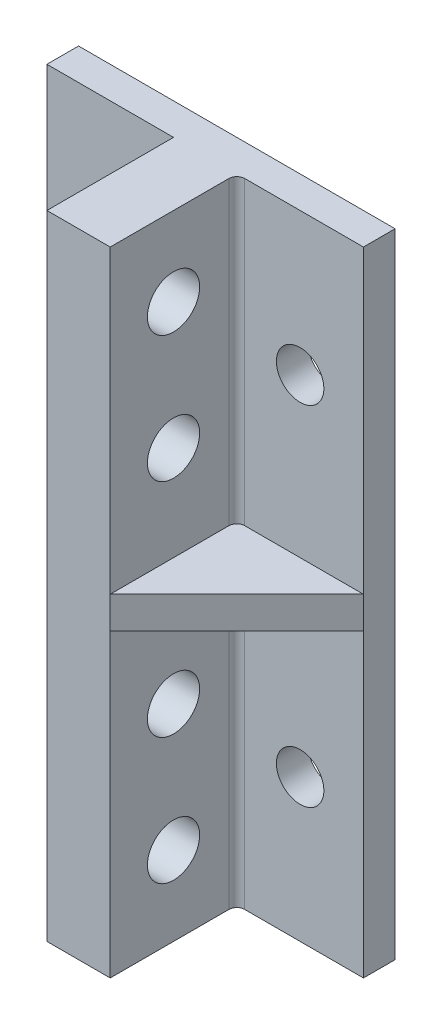
ISO-10303-21;
HEADER;
FILE_DESCRIPTION(('STEP AP214'),'2;1');
FILE_NAME('part.step','',(''),(''),'','','');
FILE_SCHEMA(('AUTOMOTIVE_DESIGN { 1 0 10303 214 1 1 1 1 }'));
ENDSEC;
DATA;
#1=APPLICATION_CONTEXT('core data for automotive mechanical design processes');
#2=APPLICATION_PROTOCOL_DEFINITION('international standard','automotive_design',2000,#1);
#3=PRODUCT_CONTEXT('',#1,'mechanical');
#4=PRODUCT('Part','Part','',(#3));
#5=PRODUCT_RELATED_PRODUCT_CATEGORY('part','',(#4));
#6=PRODUCT_DEFINITION_FORMATION('','',#4);
#7=PRODUCT_DEFINITION_CONTEXT('part definition',#1,'design');
#8=PRODUCT_DEFINITION('design','',#6,#7);
#9=PRODUCT_DEFINITION_SHAPE('','',#8);
#10=(LENGTH_UNIT() NAMED_UNIT(*) SI_UNIT(.MILLI.,.METRE.));
#11=(NAMED_UNIT(*) PLANE_ANGLE_UNIT() SI_UNIT($,.RADIAN.));
#12=(NAMED_UNIT(*) SI_UNIT($,.STERADIAN.) SOLID_ANGLE_UNIT());
#13=UNCERTAINTY_MEASURE_WITH_UNIT(LENGTH_MEASURE(1.E-05),#10,'distance_accuracy_value','');
#14=(GEOMETRIC_REPRESENTATION_CONTEXT(3) GLOBAL_UNCERTAINTY_ASSIGNED_CONTEXT((#13)) GLOBAL_UNIT_ASSIGNED_CONTEXT((#10,
#11,#12)) REPRESENTATION_CONTEXT('',''));
#15=CARTESIAN_POINT('',(0.,0.,0.));
#16=DIRECTION('',(0.,0.,1.));
#17=DIRECTION('',(1.,0.,0.));
#18=AXIS2_PLACEMENT_3D('',#15,#16,#17);
#19=CARTESIAN_POINT('',(2.5,-20.,2.5));
#20=DIRECTION('',(0.,-1.,0.));
#21=DIRECTION('',(0.,0.,-1.));
#22=AXIS2_PLACEMENT_3D('',#19,#20,#21);
#23=CYLINDRICAL_SURFACE('',#22,0.5);
#24=DIRECTION('',(0.,1.,0.));
#25=VECTOR('',#24,1.);
#26=CARTESIAN_POINT('',(2.5,0.,2.));
#27=LINE('',#26,#25);
#28=CARTESIAN_POINT('',(2.5,-20.,2.));
#29=VERTEX_POINT('',#28);
#30=CARTESIAN_POINT('',(2.5,-1.,2.));
#31=VERTEX_POINT('',#30);
#32=EDGE_CURVE('E127',#29,#31,#27,.T.);
#33=ORIENTED_EDGE('',*,*,#32,.T.);
#34=CARTESIAN_POINT('',(2.5,-1.,2.5));
#35=DIRECTION('',(0.,-1.,0.));
#36=DIRECTION('',(0.,0.,-1.));
#37=AXIS2_PLACEMENT_3D('',#34,#35,#36);
#38=CIRCLE('',#37,0.5);
#39=CARTESIAN_POINT('',(2.,-1.,2.5));
#40=VERTEX_POINT('',#39);
#41=EDGE_CURVE('E120',#31,#40,#38,.F.);
#42=ORIENTED_EDGE('',*,*,#41,.T.);
#43=DIRECTION('',(0.,1.,0.));
#44=VECTOR('',#43,1.);
#45=CARTESIAN_POINT('',(2.,-20.,2.5));
#46=LINE('',#45,#44);
#47=CARTESIAN_POINT('',(2.,-20.,2.5));
#48=VERTEX_POINT('',#47);
#49=EDGE_CURVE('E122',#40,#48,#46,.F.);
#50=ORIENTED_EDGE('',*,*,#49,.T.);
#51=CARTESIAN_POINT('',(2.5,-20.,2.5));
#52=DIRECTION('',(0.,-1.,0.));
#53=DIRECTION('',(0.,0.,-1.));
#54=AXIS2_PLACEMENT_3D('',#51,#52,#53);
#55=CIRCLE('',#54,0.5);
#56=EDGE_CURVE('E20',#29,#48,#55,.F.);
#57=ORIENTED_EDGE('',*,*,#56,.F.);
#58=EDGE_LOOP('',(#33,#42,#50,#57));
#59=FACE_BOUND('',#58,.T.);
#60=ADVANCED_FACE('F17',(#59),#23,.F.);
#61=CARTESIAN_POINT('',(0.,-1.,0.));
#62=DIRECTION('',(0.,1.,0.));
#63=DIRECTION('',(0.,0.,1.));
#64=AXIS2_PLACEMENT_3D('',#61,#62,#63);
#65=PLANE('',#64);
#66=ORIENTED_EDGE('',*,*,#41,.F.);
#67=DIRECTION('',(-1.,0.,0.));
#68=VECTOR('',#67,1.);
#69=CARTESIAN_POINT('',(0.,-1.,2.));
#70=LINE('',#69,#68);
#71=CARTESIAN_POINT('',(10.,-1.,2.));
#72=VERTEX_POINT('',#71);
#73=EDGE_CURVE('E190',#31,#72,#70,.F.);
#74=ORIENTED_EDGE('',*,*,#73,.T.);
#75=DIRECTION('',(0.707106781186547,0.,-0.707106781186548));
#76=VECTOR('',#75,1.);
#77=CARTESIAN_POINT('',(2.,-1.,10.));
#78=LINE('',#77,#76);
#79=CARTESIAN_POINT('',(2.,-1.,10.));
#80=VERTEX_POINT('',#79);
#81=EDGE_CURVE('E242',#80,#72,#78,.T.);
#82=ORIENTED_EDGE('',*,*,#81,.F.);
#83=DIRECTION('',(0.,0.,1.));
#84=VECTOR('',#83,1.);
#85=CARTESIAN_POINT('',(2.,-1.,10.));
#86=LINE('',#85,#84);
#87=EDGE_CURVE('E128',#80,#40,#86,.F.);
#88=ORIENTED_EDGE('',*,*,#87,.T.);
#89=EDGE_LOOP('',(#66,#74,#82,#88));
#90=FACE_BOUND('',#89,.T.);
#91=ADVANCED_FACE('F354',(#90),#65,.F.);
#92=CARTESIAN_POINT('',(2.5,-20.,2.5));
#93=DIRECTION('',(0.,-1.,0.));
#94=DIRECTION('',(0.,0.,-1.));
#95=AXIS2_PLACEMENT_3D('',#92,#93,#94);
#96=CYLINDRICAL_SURFACE('',#95,0.5);
#97=DIRECTION('',(0.,1.,0.));
#98=VECTOR('',#97,1.);
#99=CARTESIAN_POINT('',(2.5,0.,2.));
#100=LINE('',#99,#98);
#101=CARTESIAN_POINT('',(2.5,1.,2.));
#102=VERTEX_POINT('',#101);
#103=CARTESIAN_POINT('',(2.5,20.,2.));
#104=VERTEX_POINT('',#103);
#105=EDGE_CURVE('E162',#102,#104,#100,.T.);
#106=ORIENTED_EDGE('',*,*,#105,.T.);
#107=CARTESIAN_POINT('',(2.5,20.,2.5));
#108=DIRECTION('',(0.,-1.,0.));
#109=DIRECTION('',(0.,0.,-1.));
#110=AXIS2_PLACEMENT_3D('',#107,#108,#109);
#111=CIRCLE('',#110,0.5);
#112=CARTESIAN_POINT('',(2.,20.,2.5));
#113=VERTEX_POINT('',#112);
#114=EDGE_CURVE('E301',#113,#104,#111,.T.);
#115=ORIENTED_EDGE('',*,*,#114,.F.);
#116=DIRECTION('',(0.,1.,0.));
#117=VECTOR('',#116,1.);
#118=CARTESIAN_POINT('',(2.,-20.,2.5));
#119=LINE('',#118,#117);
#120=CARTESIAN_POINT('',(2.,1.,2.5));
#121=VERTEX_POINT('',#120);
#122=EDGE_CURVE('E146',#113,#121,#119,.F.);
#123=ORIENTED_EDGE('',*,*,#122,.T.);
#124=CARTESIAN_POINT('',(2.5,1.,2.5));
#125=DIRECTION('',(0.,-1.,0.));
#126=DIRECTION('',(0.,0.,-1.));
#127=AXIS2_PLACEMENT_3D('',#124,#125,#126);
#128=CIRCLE('',#127,0.5);
#129=EDGE_CURVE('E243',#102,#121,#128,.F.);
#130=ORIENTED_EDGE('',*,*,#129,.F.);
#131=EDGE_LOOP('',(#106,#115,#123,#130));
#132=FACE_BOUND('',#131,.T.);
#133=ADVANCED_FACE('F312',(#132),#96,.F.);
#134=CARTESIAN_POINT('',(0.,1.,0.));
#135=DIRECTION('',(0.,1.,0.));
#136=DIRECTION('',(0.,0.,1.));
#137=AXIS2_PLACEMENT_3D('',#134,#135,#136);
#138=PLANE('',#137);
#139=DIRECTION('',(0.,0.,1.));
#140=VECTOR('',#139,1.);
#141=CARTESIAN_POINT('',(2.,1.,10.));
#142=LINE('',#141,#140);
#143=CARTESIAN_POINT('',(2.,1.,10.));
#144=VERTEX_POINT('',#143);
#145=EDGE_CURVE('E148',#121,#144,#142,.T.);
#146=ORIENTED_EDGE('',*,*,#145,.T.);
#147=DIRECTION('',(0.707106781186547,0.,-0.707106781186548));
#148=VECTOR('',#147,1.);
#149=CARTESIAN_POINT('',(2.,1.,10.));
#150=LINE('',#149,#148);
#151=CARTESIAN_POINT('',(10.,1.,2.));
#152=VERTEX_POINT('',#151);
#153=EDGE_CURVE('E239',#152,#144,#150,.F.);
#154=ORIENTED_EDGE('',*,*,#153,.F.);
#155=DIRECTION('',(-1.,0.,0.));
#156=VECTOR('',#155,1.);
#157=CARTESIAN_POINT('',(0.,1.,2.));
#158=LINE('',#157,#156);
#159=EDGE_CURVE('E166',#152,#102,#158,.T.);
#160=ORIENTED_EDGE('',*,*,#159,.T.);
#161=ORIENTED_EDGE('',*,*,#129,.T.);
#162=EDGE_LOOP('',(#146,#154,#160,#161));
#163=FACE_BOUND('',#162,.T.);
#164=ADVANCED_FACE('F375',(#163),#138,.T.);
#165=CARTESIAN_POINT('',(-2.,15.,6.));
#166=DIRECTION('',(-1.,0.,0.));
#167=DIRECTION('',(0.,0.,1.));
#168=AXIS2_PLACEMENT_3D('',#165,#166,#167);
#169=CYLINDRICAL_SURFACE('',#168,1.64999999999999);
#170=CARTESIAN_POINT('',(2.,15.,6.));
#171=DIRECTION('',(-1.,0.,0.));
#172=DIRECTION('',(0.,0.,1.));
#173=AXIS2_PLACEMENT_3D('',#170,#171,#172);
#174=CIRCLE('',#173,1.64999999999999);
#175=CARTESIAN_POINT('',(2.,15.,7.64999999999999));
#176=VERTEX_POINT('',#175);
#177=EDGE_CURVE('E165',#176,#176,#174,.F.);
#178=ORIENTED_EDGE('',*,*,#177,.T.);
#179=EDGE_LOOP('',(#178));
#180=FACE_BOUND('',#179,.T.);
#181=CARTESIAN_POINT('',(-2.,15.,6.));
#182=DIRECTION('',(-1.,0.,0.));
#183=DIRECTION('',(0.,0.,1.));
#184=AXIS2_PLACEMENT_3D('',#181,#182,#183);
#185=CIRCLE('',#184,1.64999999999999);
#186=CARTESIAN_POINT('',(-2.,15.,7.64999999999999));
#187=VERTEX_POINT('',#186);
#188=EDGE_CURVE('E204',#187,#187,#185,.T.);
#189=ORIENTED_EDGE('',*,*,#188,.T.);
#190=EDGE_LOOP('',(#189));
#191=FACE_BOUND('',#190,.T.);
#192=ADVANCED_FACE('F372',(#180,#191),#169,.F.);
#193=CARTESIAN_POINT('',(-2.,7.,6.));
#194=DIRECTION('',(-1.,0.,0.));
#195=DIRECTION('',(0.,0.,1.));
#196=AXIS2_PLACEMENT_3D('',#193,#194,#195);
#197=CYLINDRICAL_SURFACE('',#196,1.64999999999999);
#198=CARTESIAN_POINT('',(2.,7.,6.));
#199=DIRECTION('',(-1.,0.,0.));
#200=DIRECTION('',(0.,0.,1.));
#201=AXIS2_PLACEMENT_3D('',#198,#199,#200);
#202=CIRCLE('',#201,1.64999999999999);
#203=CARTESIAN_POINT('',(2.,7.,7.64999999999999));
#204=VERTEX_POINT('',#203);
#205=EDGE_CURVE('E149',#204,#204,#202,.F.);
#206=ORIENTED_EDGE('',*,*,#205,.T.);
#207=EDGE_LOOP('',(#206));
#208=FACE_BOUND('',#207,.T.);
#209=CARTESIAN_POINT('',(-2.,7.,6.));
#210=DIRECTION('',(-1.,0.,0.));
#211=DIRECTION('',(0.,0.,1.));
#212=AXIS2_PLACEMENT_3D('',#209,#210,#211);
#213=CIRCLE('',#212,1.64999999999999);
#214=CARTESIAN_POINT('',(-2.,7.,7.64999999999999));
#215=VERTEX_POINT('',#214);
#216=EDGE_CURVE('E286',#215,#215,#213,.T.);
#217=ORIENTED_EDGE('',*,*,#216,.T.);
#218=EDGE_LOOP('',(#217));
#219=FACE_BOUND('',#218,.T.);
#220=ADVANCED_FACE('F374',(#208,#219),#197,.F.);
#221=CARTESIAN_POINT('',(-2.,-7.,6.));
#222=DIRECTION('',(-1.,0.,0.));
#223=DIRECTION('',(0.,0.,1.));
#224=AXIS2_PLACEMENT_3D('',#221,#222,#223);
#225=CYLINDRICAL_SURFACE('',#224,1.64999999999999);
#226=CARTESIAN_POINT('',(2.,-7.,6.));
#227=DIRECTION('',(-1.,0.,0.));
#228=DIRECTION('',(0.,0.,1.));
#229=AXIS2_PLACEMENT_3D('',#226,#227,#228);
#230=CIRCLE('',#229,1.64999999999999);
#231=CARTESIAN_POINT('',(2.,-7.,7.64999999999999));
#232=VERTEX_POINT('',#231);
#233=EDGE_CURVE('E248',#232,#232,#230,.F.);
#234=ORIENTED_EDGE('',*,*,#233,.T.);
#235=EDGE_LOOP('',(#234));
#236=FACE_BOUND('',#235,.T.);
#237=CARTESIAN_POINT('',(-2.,-7.,6.));
#238=DIRECTION('',(-1.,0.,0.));
#239=DIRECTION('',(0.,0.,1.));
#240=AXIS2_PLACEMENT_3D('',#237,#238,#239);
#241=CIRCLE('',#240,1.64999999999999);
#242=CARTESIAN_POINT('',(-2.,-7.,7.64999999999999));
#243=VERTEX_POINT('',#242);
#244=EDGE_CURVE('E283',#243,#243,#241,.T.);
#245=ORIENTED_EDGE('',*,*,#244,.T.);
#246=EDGE_LOOP('',(#245));
#247=FACE_BOUND('',#246,.T.);
#248=ADVANCED_FACE('F383',(#236,#247),#225,.F.);
#249=CARTESIAN_POINT('',(-2.,-15.,6.));
#250=DIRECTION('',(-1.,0.,0.));
#251=DIRECTION('',(0.,0.,1.));
#252=AXIS2_PLACEMENT_3D('',#249,#250,#251);
#253=CYLINDRICAL_SURFACE('',#252,1.64999999999999);
#254=CARTESIAN_POINT('',(2.,-15.,6.));
#255=DIRECTION('',(-1.,0.,0.));
#256=DIRECTION('',(0.,0.,1.));
#257=AXIS2_PLACEMENT_3D('',#254,#255,#256);
#258=CIRCLE('',#257,1.64999999999999);
#259=CARTESIAN_POINT('',(2.,-15.,7.64999999999999));
#260=VERTEX_POINT('',#259);
#261=EDGE_CURVE('E262',#260,#260,#258,.F.);
#262=ORIENTED_EDGE('',*,*,#261,.T.);
#263=EDGE_LOOP('',(#262));
#264=FACE_BOUND('',#263,.T.);
#265=CARTESIAN_POINT('',(-2.,-15.,6.));
#266=DIRECTION('',(-1.,0.,0.));
#267=DIRECTION('',(0.,0.,1.));
#268=AXIS2_PLACEMENT_3D('',#265,#266,#267);
#269=CIRCLE('',#268,1.64999999999999);
#270=CARTESIAN_POINT('',(-2.,-15.,7.64999999999999));
#271=VERTEX_POINT('',#270);
#272=EDGE_CURVE('E214',#271,#271,#269,.T.);
#273=ORIENTED_EDGE('',*,*,#272,.T.);
#274=EDGE_LOOP('',(#273));
#275=FACE_BOUND('',#274,.T.);
#276=ADVANCED_FACE('F425',(#264,#275),#253,.F.);
#277=CARTESIAN_POINT('',(2.,-1.,10.));
#278=DIRECTION('',(0.707106781186548,0.,0.707106781186547));
#279=DIRECTION('',(0.707106781186547,0.,-0.707106781186548));
#280=AXIS2_PLACEMENT_3D('',#277,#278,#279);
#281=PLANE('',#280);
#282=DIRECTION('',(0.,1.,0.));
#283=VECTOR('',#282,1.);
#284=CARTESIAN_POINT('',(2.,0.,10.));
#285=LINE('',#284,#283);
#286=EDGE_CURVE('E153',#144,#80,#285,.F.);
#287=ORIENTED_EDGE('',*,*,#286,.T.);
#288=ORIENTED_EDGE('',*,*,#81,.T.);
#289=DIRECTION('',(0.,1.,0.));
#290=VECTOR('',#289,1.);
#291=CARTESIAN_POINT('',(10.,-20.,2.));
#292=LINE('',#291,#290);
#293=EDGE_CURVE('E177',#72,#152,#292,.T.);
#294=ORIENTED_EDGE('',*,*,#293,.T.);
#295=ORIENTED_EDGE('',*,*,#153,.T.);
#296=EDGE_LOOP('',(#287,#288,#294,#295));
#297=FACE_BOUND('',#296,.T.);
#298=ADVANCED_FACE('F351',(#297),#281,.T.);
#299=CARTESIAN_POINT('',(2.,-20.,10.));
#300=DIRECTION('',(-1.,0.,0.));
#301=DIRECTION('',(0.,0.,1.));
#302=AXIS2_PLACEMENT_3D('',#299,#300,#301);
#303=PLANE('',#302);
#304=ORIENTED_EDGE('',*,*,#49,.F.);
#305=ORIENTED_EDGE('',*,*,#87,.F.);
#306=DIRECTION('',(0.,1.,0.));
#307=VECTOR('',#306,1.);
#308=CARTESIAN_POINT('',(2.,0.,10.));
#309=LINE('',#308,#307);
#310=CARTESIAN_POINT('',(2.,-20.,10.));
#311=VERTEX_POINT('',#310);
#312=EDGE_CURVE('E133',#80,#311,#309,.F.);
#313=ORIENTED_EDGE('',*,*,#312,.T.);
#314=DIRECTION('',(0.,0.,1.));
#315=VECTOR('',#314,1.);
#316=CARTESIAN_POINT('',(2.,-20.,2.));
#317=LINE('',#316,#315);
#318=EDGE_CURVE('E118',#311,#48,#317,.F.);
#319=ORIENTED_EDGE('',*,*,#318,.T.);
#320=EDGE_LOOP('',(#304,#305,#313,#319));
#321=FACE_BOUND('',#320,.T.);
#322=ORIENTED_EDGE('',*,*,#261,.F.);
#323=EDGE_LOOP('',(#322));
#324=FACE_BOUND('',#323,.T.);
#325=ORIENTED_EDGE('',*,*,#233,.F.);
#326=EDGE_LOOP('',(#325));
#327=FACE_BOUND('',#326,.T.);
#328=ADVANCED_FACE('F130',(#321,#324,#327),#303,.F.);
#329=CARTESIAN_POINT('',(0.,0.,2.));
#330=DIRECTION('',(0.,0.,-1.));
#331=DIRECTION('',(-1.,0.,0.));
#332=AXIS2_PLACEMENT_3D('',#329,#330,#331);
#333=PLANE('',#332);
#334=ORIENTED_EDGE('',*,*,#32,.F.);
#335=DIRECTION('',(1.,0.,0.));
#336=VECTOR('',#335,1.);
#337=CARTESIAN_POINT('',(-10.,-20.,2.));
#338=LINE('',#337,#336);
#339=CARTESIAN_POINT('',(10.,-20.,2.));
#340=VERTEX_POINT('',#339);
#341=EDGE_CURVE('E119',#29,#340,#338,.T.);
#342=ORIENTED_EDGE('',*,*,#341,.T.);
#343=DIRECTION('',(0.,1.,0.));
#344=VECTOR('',#343,1.);
#345=CARTESIAN_POINT('',(10.,-20.,2.));
#346=LINE('',#345,#344);
#347=EDGE_CURVE('E191',#340,#72,#346,.T.);
#348=ORIENTED_EDGE('',*,*,#347,.T.);
#349=ORIENTED_EDGE('',*,*,#73,.F.);
#350=EDGE_LOOP('',(#334,#342,#348,#349));
#351=FACE_BOUND('',#350,.T.);
#352=CARTESIAN_POINT('',(6.,-11.,2.));
#353=DIRECTION('',(0.,0.,1.));
#354=DIRECTION('',(1.,0.,0.));
#355=AXIS2_PLACEMENT_3D('',#352,#353,#354);
#356=CIRCLE('',#355,1.5);
#357=CARTESIAN_POINT('',(7.5,-11.,2.));
#358=VERTEX_POINT('',#357);
#359=EDGE_CURVE('E194',#358,#358,#356,.F.);
#360=ORIENTED_EDGE('',*,*,#359,.T.);
#361=EDGE_LOOP('',(#360));
#362=FACE_BOUND('',#361,.T.);
#363=ADVANCED_FACE('F348',(#351,#362),#333,.F.);
#364=CARTESIAN_POINT('',(0.,0.,2.));
#365=DIRECTION('',(0.,0.,-1.));
#366=DIRECTION('',(-1.,0.,0.));
#367=AXIS2_PLACEMENT_3D('',#364,#365,#366);
#368=PLANE('',#367);
#369=ORIENTED_EDGE('',*,*,#105,.F.);
#370=ORIENTED_EDGE('',*,*,#159,.F.);
#371=DIRECTION('',(0.,1.,0.));
#372=VECTOR('',#371,1.);
#373=CARTESIAN_POINT('',(10.,-20.,2.));
#374=LINE('',#373,#372);
#375=CARTESIAN_POINT('',(10.,20.,2.));
#376=VERTEX_POINT('',#375);
#377=EDGE_CURVE('E174',#152,#376,#374,.T.);
#378=ORIENTED_EDGE('',*,*,#377,.T.);
#379=DIRECTION('',(1.,0.,0.));
#380=VECTOR('',#379,1.);
#381=CARTESIAN_POINT('',(-10.,20.,2.));
#382=LINE('',#381,#380);
#383=EDGE_CURVE('E170',#376,#104,#382,.F.);
#384=ORIENTED_EDGE('',*,*,#383,.T.);
#385=EDGE_LOOP('',(#369,#370,#378,#384));
#386=FACE_BOUND('',#385,.T.);
#387=CARTESIAN_POINT('',(6.,11.,2.));
#388=DIRECTION('',(0.,0.,1.));
#389=DIRECTION('',(1.,0.,0.));
#390=AXIS2_PLACEMENT_3D('',#387,#388,#389);
#391=CIRCLE('',#390,1.5);
#392=CARTESIAN_POINT('',(7.5,11.,2.));
#393=VERTEX_POINT('',#392);
#394=EDGE_CURVE('E222',#393,#393,#391,.F.);
#395=ORIENTED_EDGE('',*,*,#394,.T.);
#396=EDGE_LOOP('',(#395));
#397=FACE_BOUND('',#396,.T.);
#398=ADVANCED_FACE('F315',(#386,#397),#368,.F.);
#399=CARTESIAN_POINT('',(2.,-20.,10.));
#400=DIRECTION('',(-1.,0.,0.));
#401=DIRECTION('',(0.,0.,1.));
#402=AXIS2_PLACEMENT_3D('',#399,#400,#401);
#403=PLANE('',#402);
#404=ORIENTED_EDGE('',*,*,#122,.F.);
#405=DIRECTION('',(0.,0.,-1.));
#406=VECTOR('',#405,1.);
#407=CARTESIAN_POINT('',(2.,20.,2.));
#408=LINE('',#407,#406);
#409=CARTESIAN_POINT('',(2.,20.,10.));
#410=VERTEX_POINT('',#409);
#411=EDGE_CURVE('E159',#113,#410,#408,.F.);
#412=ORIENTED_EDGE('',*,*,#411,.T.);
#413=DIRECTION('',(0.,1.,0.));
#414=VECTOR('',#413,1.);
#415=CARTESIAN_POINT('',(2.,0.,10.));
#416=LINE('',#415,#414);
#417=EDGE_CURVE('E150',#410,#144,#416,.F.);
#418=ORIENTED_EDGE('',*,*,#417,.T.);
#419=ORIENTED_EDGE('',*,*,#145,.F.);
#420=EDGE_LOOP('',(#404,#412,#418,#419));
#421=FACE_BOUND('',#420,.T.);
#422=ORIENTED_EDGE('',*,*,#205,.F.);
#423=EDGE_LOOP('',(#422));
#424=FACE_BOUND('',#423,.T.);
#425=ORIENTED_EDGE('',*,*,#177,.F.);
#426=EDGE_LOOP('',(#425));
#427=FACE_BOUND('',#426,.T.);
#428=ADVANCED_FACE('F413',(#421,#424,#427),#403,.F.);
#429=CARTESIAN_POINT('',(0.,0.,10.));
#430=DIRECTION('',(0.,0.,-1.));
#431=DIRECTION('',(-1.,0.,0.));
#432=AXIS2_PLACEMENT_3D('',#429,#430,#431);
#433=PLANE('',#432);
#434=ORIENTED_EDGE('',*,*,#286,.F.);
#435=ORIENTED_EDGE('',*,*,#417,.F.);
#436=DIRECTION('',(1.,0.,0.));
#437=VECTOR('',#436,1.);
#438=CARTESIAN_POINT('',(-10.,20.,10.));
#439=LINE('',#438,#437);
#440=CARTESIAN_POINT('',(-2.,20.,10.));
#441=VERTEX_POINT('',#440);
#442=EDGE_CURVE('E156',#410,#441,#439,.F.);
#443=ORIENTED_EDGE('',*,*,#442,.T.);
#444=DIRECTION('',(0.,1.,0.));
#445=VECTOR('',#444,1.);
#446=CARTESIAN_POINT('',(-2.,-20.,10.));
#447=LINE('',#446,#445);
#448=CARTESIAN_POINT('',(-2.,-20.,10.));
#449=VERTEX_POINT('',#448);
#450=EDGE_CURVE('E211',#441,#449,#447,.F.);
#451=ORIENTED_EDGE('',*,*,#450,.T.);
#452=DIRECTION('',(1.,0.,0.));
#453=VECTOR('',#452,1.);
#454=CARTESIAN_POINT('',(-10.,-20.,10.));
#455=LINE('',#454,#453);
#456=EDGE_CURVE('E135',#449,#311,#455,.T.);
#457=ORIENTED_EDGE('',*,*,#456,.T.);
#458=ORIENTED_EDGE('',*,*,#312,.F.);
#459=EDGE_LOOP('',(#434,#435,#443,#451,#457,#458));
#460=FACE_BOUND('',#459,.T.);
#461=ADVANCED_FACE('F356',(#460),#433,.F.);
#462=CARTESIAN_POINT('',(-2.,-20.,10.));
#463=DIRECTION('',(1.,0.,0.));
#464=DIRECTION('',(0.,0.,-1.));
#465=AXIS2_PLACEMENT_3D('',#462,#463,#464);
#466=PLANE('',#465);
#467=DIRECTION('',(0.,0.,1.));
#468=VECTOR('',#467,1.);
#469=CARTESIAN_POINT('',(-2.,-20.,2.));
#470=LINE('',#469,#468);
#471=CARTESIAN_POINT('',(-2.,-20.,2.));
#472=VERTEX_POINT('',#471);
#473=EDGE_CURVE('E139',#472,#449,#470,.T.);
#474=ORIENTED_EDGE('',*,*,#473,.T.);
#475=ORIENTED_EDGE('',*,*,#450,.F.);
#476=DIRECTION('',(0.,0.,-1.));
#477=VECTOR('',#476,1.);
#478=CARTESIAN_POINT('',(-2.,20.,2.));
#479=LINE('',#478,#477);
#480=CARTESIAN_POINT('',(-2.,20.,2.));
#481=VERTEX_POINT('',#480);
#482=EDGE_CURVE('E158',#441,#481,#479,.T.);
#483=ORIENTED_EDGE('',*,*,#482,.T.);
#484=DIRECTION('',(0.,1.,0.));
#485=VECTOR('',#484,1.);
#486=CARTESIAN_POINT('',(-2.,0.,2.));
#487=LINE('',#486,#485);
#488=EDGE_CURVE('E213',#481,#472,#487,.F.);
#489=ORIENTED_EDGE('',*,*,#488,.T.);
#490=EDGE_LOOP('',(#474,#475,#483,#489));
#491=FACE_BOUND('',#490,.T.);
#492=ORIENTED_EDGE('',*,*,#272,.F.);
#493=EDGE_LOOP('',(#492));
#494=FACE_BOUND('',#493,.T.);
#495=ORIENTED_EDGE('',*,*,#244,.F.);
#496=EDGE_LOOP('',(#495));
#497=FACE_BOUND('',#496,.T.);
#498=ORIENTED_EDGE('',*,*,#216,.F.);
#499=EDGE_LOOP('',(#498));
#500=FACE_BOUND('',#499,.T.);
#501=ORIENTED_EDGE('',*,*,#188,.F.);
#502=EDGE_LOOP('',(#501));
#503=FACE_BOUND('',#502,.T.);
#504=ADVANCED_FACE('F360',(#491,#494,#497,#500,#503),#466,.F.);
#505=CARTESIAN_POINT('',(0.,0.,2.));
#506=DIRECTION('',(0.,0.,-1.));
#507=DIRECTION('',(-1.,0.,0.));
#508=AXIS2_PLACEMENT_3D('',#505,#506,#507);
#509=PLANE('',#508);
#510=DIRECTION('',(1.,0.,0.));
#511=VECTOR('',#510,1.);
#512=CARTESIAN_POINT('',(-10.,20.,2.));
#513=LINE('',#512,#511);
#514=CARTESIAN_POINT('',(-10.,20.,2.));
#515=VERTEX_POINT('',#514);
#516=EDGE_CURVE('E255',#481,#515,#513,.F.);
#517=ORIENTED_EDGE('',*,*,#516,.T.);
#518=DIRECTION('',(0.,1.,0.));
#519=VECTOR('',#518,1.);
#520=CARTESIAN_POINT('',(-10.,-20.,2.));
#521=LINE('',#520,#519);
#522=CARTESIAN_POINT('',(-10.,-20.,2.));
#523=VERTEX_POINT('',#522);
#524=EDGE_CURVE('E198',#515,#523,#521,.F.);
#525=ORIENTED_EDGE('',*,*,#524,.T.);
#526=DIRECTION('',(1.,0.,0.));
#527=VECTOR('',#526,1.);
#528=CARTESIAN_POINT('',(-10.,-20.,2.));
#529=LINE('',#528,#527);
#530=EDGE_CURVE('E176',#523,#472,#529,.T.);
#531=ORIENTED_EDGE('',*,*,#530,.T.);
#532=ORIENTED_EDGE('',*,*,#488,.F.);
#533=EDGE_LOOP('',(#517,#525,#531,#532));
#534=FACE_BOUND('',#533,.T.);
#535=ADVANCED_FACE('F339',(#534),#509,.F.);
#536=CARTESIAN_POINT('',(6.,11.,-8.));
#537=DIRECTION('',(0.,0.,1.));
#538=DIRECTION('',(1.,0.,0.));
#539=AXIS2_PLACEMENT_3D('',#536,#537,#538);
#540=CYLINDRICAL_SURFACE('',#539,1.5);
#541=CARTESIAN_POINT('',(6.,11.,0.));
#542=DIRECTION('',(0.,0.,1.));
#543=DIRECTION('',(1.,0.,0.));
#544=AXIS2_PLACEMENT_3D('',#541,#542,#543);
#545=CIRCLE('',#544,1.5);
#546=CARTESIAN_POINT('',(7.5,11.,0.));
#547=VERTEX_POINT('',#546);
#548=EDGE_CURVE('E274',#547,#547,#545,.T.);
#549=ORIENTED_EDGE('',*,*,#548,.F.);
#550=EDGE_LOOP('',(#549));
#551=FACE_BOUND('',#550,.T.);
#552=ORIENTED_EDGE('',*,*,#394,.F.);
#553=EDGE_LOOP('',(#552));
#554=FACE_BOUND('',#553,.T.);
#555=ADVANCED_FACE('F404',(#551,#554),#540,.F.);
#556=CARTESIAN_POINT('',(6.,-11.,-8.));
#557=DIRECTION('',(0.,0.,1.));
#558=DIRECTION('',(1.,0.,0.));
#559=AXIS2_PLACEMENT_3D('',#556,#557,#558);
#560=CYLINDRICAL_SURFACE('',#559,1.5);
#561=CARTESIAN_POINT('',(6.,-11.,0.));
#562=DIRECTION('',(0.,0.,1.));
#563=DIRECTION('',(1.,0.,0.));
#564=AXIS2_PLACEMENT_3D('',#561,#562,#563);
#565=CIRCLE('',#564,1.5);
#566=CARTESIAN_POINT('',(7.5,-11.,0.));
#567=VERTEX_POINT('',#566);
#568=EDGE_CURVE('E184',#567,#567,#565,.T.);
#569=ORIENTED_EDGE('',*,*,#568,.F.);
#570=EDGE_LOOP('',(#569));
#571=FACE_BOUND('',#570,.T.);
#572=ORIENTED_EDGE('',*,*,#359,.F.);
#573=EDGE_LOOP('',(#572));
#574=FACE_BOUND('',#573,.T.);
#575=ADVANCED_FACE('F401',(#571,#574),#560,.F.);
#576=CARTESIAN_POINT('',(10.,-20.,2.));
#577=DIRECTION('',(-1.,0.,0.));
#578=DIRECTION('',(0.,0.,1.));
#579=AXIS2_PLACEMENT_3D('',#576,#577,#578);
#580=PLANE('',#579);
#581=DIRECTION('',(0.,0.,-1.));
#582=VECTOR('',#581,1.);
#583=CARTESIAN_POINT('',(10.,20.,2.));
#584=LINE('',#583,#582);
#585=CARTESIAN_POINT('',(10.,20.,0.));
#586=VERTEX_POINT('',#585);
#587=EDGE_CURVE('E167',#586,#376,#584,.F.);
#588=ORIENTED_EDGE('',*,*,#587,.T.);
#589=ORIENTED_EDGE('',*,*,#377,.F.);
#590=ORIENTED_EDGE('',*,*,#293,.F.);
#591=ORIENTED_EDGE('',*,*,#347,.F.);
#592=DIRECTION('',(0.,0.,1.));
#593=VECTOR('',#592,1.);
#594=CARTESIAN_POINT('',(10.,-20.,2.));
#595=LINE('',#594,#593);
#596=CARTESIAN_POINT('',(10.,-20.,0.));
#597=VERTEX_POINT('',#596);
#598=EDGE_CURVE('E137',#340,#597,#595,.F.);
#599=ORIENTED_EDGE('',*,*,#598,.T.);
#600=DIRECTION('',(0.,1.,0.));
#601=VECTOR('',#600,1.);
#602=CARTESIAN_POINT('',(10.,0.,0.));
#603=LINE('',#602,#601);
#604=EDGE_CURVE('E180',#586,#597,#603,.F.);
#605=ORIENTED_EDGE('',*,*,#604,.F.);
#606=EDGE_LOOP('',(#588,#589,#590,#591,#599,#605));
#607=FACE_BOUND('',#606,.T.);
#608=ADVANCED_FACE('F343',(#607),#580,.F.);
#609=CARTESIAN_POINT('',(-10.,-20.,2.));
#610=DIRECTION('',(0.,1.,0.));
#611=DIRECTION('',(0.,0.,1.));
#612=AXIS2_PLACEMENT_3D('',#609,#610,#611);
#613=PLANE('',#612);
#614=ORIENTED_EDGE('',*,*,#598,.F.);
#615=ORIENTED_EDGE('',*,*,#341,.F.);
#616=ORIENTED_EDGE('',*,*,#56,.T.);
#617=ORIENTED_EDGE('',*,*,#318,.F.);
#618=ORIENTED_EDGE('',*,*,#456,.F.);
#619=ORIENTED_EDGE('',*,*,#473,.F.);
#620=ORIENTED_EDGE('',*,*,#530,.F.);
#621=DIRECTION('',(0.,0.,-1.));
#622=VECTOR('',#621,1.);
#623=CARTESIAN_POINT('',(-10.,-20.,2.));
#624=LINE('',#623,#622);
#625=CARTESIAN_POINT('',(-10.,-20.,0.));
#626=VERTEX_POINT('',#625);
#627=EDGE_CURVE('E171',#523,#626,#624,.T.);
#628=ORIENTED_EDGE('',*,*,#627,.T.);
#629=DIRECTION('',(-1.,0.,0.));
#630=VECTOR('',#629,1.);
#631=CARTESIAN_POINT('',(0.,-20.,0.));
#632=LINE('',#631,#630);
#633=EDGE_CURVE('E183',#597,#626,#632,.T.);
#634=ORIENTED_EDGE('',*,*,#633,.F.);
#635=EDGE_LOOP('',(#614,#615,#616,#617,#618,#619,#620,#628,#634));
#636=FACE_BOUND('',#635,.T.);
#637=ADVANCED_FACE('F115',(#636),#613,.F.);
#638=CARTESIAN_POINT('',(-10.,-20.,2.));
#639=DIRECTION('',(1.,0.,0.));
#640=DIRECTION('',(0.,0.,-1.));
#641=AXIS2_PLACEMENT_3D('',#638,#639,#640);
#642=PLANE('',#641);
#643=ORIENTED_EDGE('',*,*,#627,.F.);
#644=ORIENTED_EDGE('',*,*,#524,.F.);
#645=DIRECTION('',(0.,0.,-1.));
#646=VECTOR('',#645,1.);
#647=CARTESIAN_POINT('',(-10.,20.,2.));
#648=LINE('',#647,#646);
#649=CARTESIAN_POINT('',(-10.,20.,0.));
#650=VERTEX_POINT('',#649);
#651=EDGE_CURVE('E35',#515,#650,#648,.T.);
#652=ORIENTED_EDGE('',*,*,#651,.T.);
#653=DIRECTION('',(0.,1.,0.));
#654=VECTOR('',#653,1.);
#655=CARTESIAN_POINT('',(-10.,0.,0.));
#656=LINE('',#655,#654);
#657=EDGE_CURVE('E26',#626,#650,#656,.T.);
#658=ORIENTED_EDGE('',*,*,#657,.F.);
#659=EDGE_LOOP('',(#643,#644,#652,#658));
#660=FACE_BOUND('',#659,.T.);
#661=ADVANCED_FACE('F334',(#660),#642,.F.);
#662=CARTESIAN_POINT('',(-10.,20.,2.));
#663=DIRECTION('',(0.,-1.,0.));
#664=DIRECTION('',(0.,0.,-1.));
#665=AXIS2_PLACEMENT_3D('',#662,#663,#664);
#666=PLANE('',#665);
#667=ORIENTED_EDGE('',*,*,#651,.F.);
#668=ORIENTED_EDGE('',*,*,#516,.F.);
#669=ORIENTED_EDGE('',*,*,#482,.F.);
#670=ORIENTED_EDGE('',*,*,#442,.F.);
#671=ORIENTED_EDGE('',*,*,#411,.F.);
#672=ORIENTED_EDGE('',*,*,#114,.T.);
#673=ORIENTED_EDGE('',*,*,#383,.F.);
#674=ORIENTED_EDGE('',*,*,#587,.F.);
#675=DIRECTION('',(-1.,0.,0.));
#676=VECTOR('',#675,1.);
#677=CARTESIAN_POINT('',(0.,20.,0.));
#678=LINE('',#677,#676);
#679=EDGE_CURVE('E11',#650,#586,#678,.F.);
#680=ORIENTED_EDGE('',*,*,#679,.F.);
#681=EDGE_LOOP('',(#667,#668,#669,#670,#671,#672,#673,#674,#680));
#682=FACE_BOUND('',#681,.T.);
#683=ADVANCED_FACE('F305',(#682),#666,.F.);
#684=CARTESIAN_POINT('',(0.,0.,0.));
#685=DIRECTION('',(0.,0.,-1.));
#686=DIRECTION('',(-1.,0.,0.));
#687=AXIS2_PLACEMENT_3D('',#684,#685,#686);
#688=PLANE('',#687);
#689=ORIENTED_EDGE('',*,*,#657,.T.);
#690=ORIENTED_EDGE('',*,*,#679,.T.);
#691=ORIENTED_EDGE('',*,*,#604,.T.);
#692=ORIENTED_EDGE('',*,*,#633,.T.);
#693=EDGE_LOOP('',(#689,#690,#691,#692));
#694=FACE_BOUND('',#693,.T.);
#695=ORIENTED_EDGE('',*,*,#568,.T.);
#696=EDGE_LOOP('',(#695));
#697=FACE_BOUND('',#696,.T.);
#698=ORIENTED_EDGE('',*,*,#548,.T.);
#699=EDGE_LOOP('',(#698));
#700=FACE_BOUND('',#699,.T.);
#701=ADVANCED_FACE('F330',(#694,#697,#700),#688,.T.);
#702=CLOSED_SHELL('',(#60,#91,#133,#164,#192,#220,#248,#276,#298,#328,#363,#398,#428,#461,#504,
#535,#555,#575,#608,#637,#661,#683,#701));
#703=MANIFOLD_SOLID_BREP('B1',#702);
#704=ADVANCED_BREP_SHAPE_REPRESENTATION('',(#18,#703),#14);
#705=SHAPE_DEFINITION_REPRESENTATION(#9,#704);
ENDSEC;
END-ISO-10303-21;
